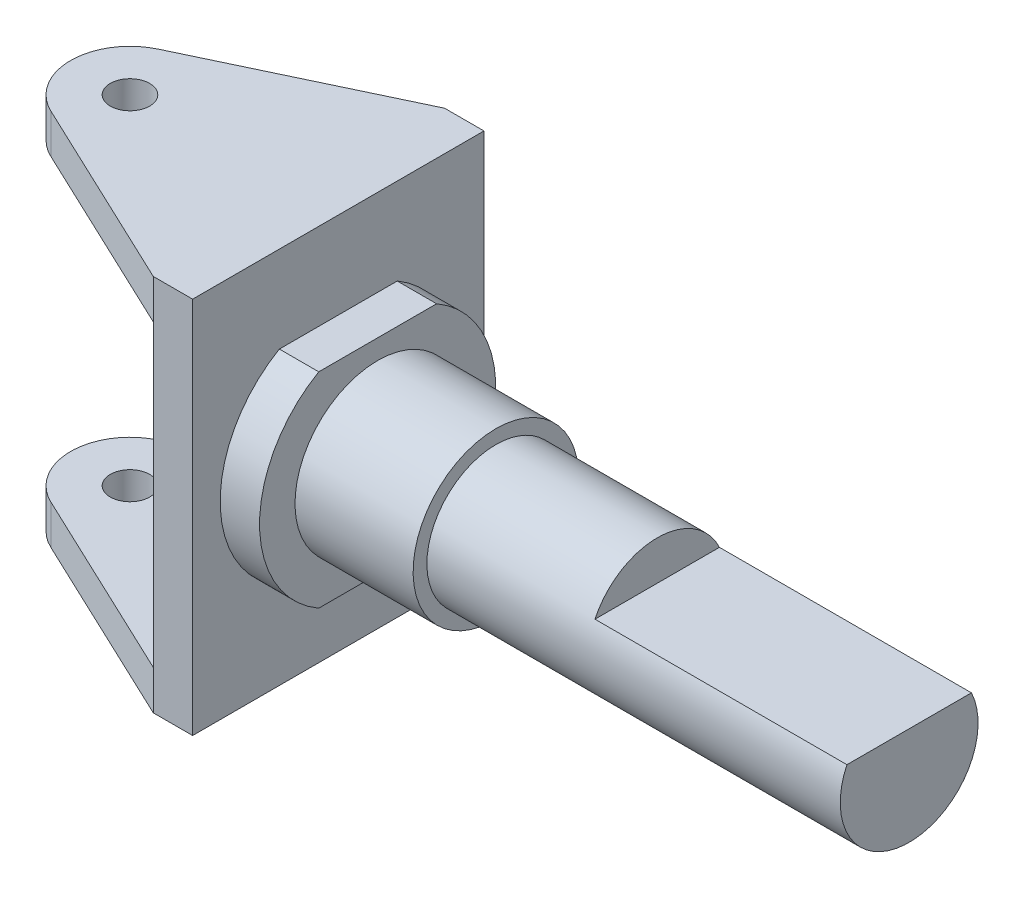
ISO-10303-21;
HEADER;
FILE_DESCRIPTION(('STEP AP214'),'2;1');
FILE_NAME('part.step','',(''),(''),'','','');
FILE_SCHEMA(('AUTOMOTIVE_DESIGN { 1 0 10303 214 1 1 1 1 }'));
ENDSEC;
DATA;
#1=APPLICATION_CONTEXT('core data for automotive mechanical design processes');
#2=APPLICATION_PROTOCOL_DEFINITION('international standard','automotive_design',2000,#1);
#3=PRODUCT_CONTEXT('',#1,'mechanical');
#4=PRODUCT('Part','Part','',(#3));
#5=PRODUCT_RELATED_PRODUCT_CATEGORY('part','',(#4));
#6=PRODUCT_DEFINITION_FORMATION('','',#4);
#7=PRODUCT_DEFINITION_CONTEXT('part definition',#1,'design');
#8=PRODUCT_DEFINITION('design','',#6,#7);
#9=PRODUCT_DEFINITION_SHAPE('','',#8);
#10=(LENGTH_UNIT() NAMED_UNIT(*) SI_UNIT(.MILLI.,.METRE.));
#11=(NAMED_UNIT(*) PLANE_ANGLE_UNIT() SI_UNIT($,.RADIAN.));
#12=(NAMED_UNIT(*) SI_UNIT($,.STERADIAN.) SOLID_ANGLE_UNIT());
#13=UNCERTAINTY_MEASURE_WITH_UNIT(LENGTH_MEASURE(1.E-05),#10,'distance_accuracy_value','');
#14=(GEOMETRIC_REPRESENTATION_CONTEXT(3) GLOBAL_UNCERTAINTY_ASSIGNED_CONTEXT((#13)) GLOBAL_UNIT_ASSIGNED_CONTEXT((#10,
#11,#12)) REPRESENTATION_CONTEXT('',''));
#15=CARTESIAN_POINT('',(0.,0.,0.));
#16=DIRECTION('',(0.,0.,1.));
#17=DIRECTION('',(1.,0.,0.));
#18=AXIS2_PLACEMENT_3D('',#15,#16,#17);
#19=CARTESIAN_POINT('',(10.,-38.,37.));
#20=DIRECTION('',(-1.,0.,0.));
#21=DIRECTION('',(0.,-1.,0.));
#22=AXIS2_PLACEMENT_3D('',#19,#20,#21);
#23=PLANE('',#22);
#24=DIRECTION('',(0.,1.,0.));
#25=VECTOR('',#24,1.);
#26=CARTESIAN_POINT('',(10.,-38.,-37.));
#27=LINE('',#26,#25);
#28=CARTESIAN_POINT('',(10.,-48.,-37.));
#29=VERTEX_POINT('',#28);
#30=CARTESIAN_POINT('',(10.,48.,-37.));
#31=VERTEX_POINT('',#30);
#32=EDGE_CURVE('E279',#29,#31,#27,.T.);
#33=ORIENTED_EDGE('',*,*,#32,.T.);
#34=DIRECTION('',(0.,0.,-1.));
#35=VECTOR('',#34,1.);
#36=CARTESIAN_POINT('',(10.,48.,37.));
#37=LINE('',#36,#35);
#38=CARTESIAN_POINT('',(10.,48.,37.));
#39=VERTEX_POINT('',#38);
#40=EDGE_CURVE('E301',#39,#31,#37,.T.);
#41=ORIENTED_EDGE('',*,*,#40,.F.);
#42=DIRECTION('',(0.,1.,0.));
#43=VECTOR('',#42,1.);
#44=CARTESIAN_POINT('',(10.,-38.,37.));
#45=LINE('',#44,#43);
#46=CARTESIAN_POINT('',(10.,-48.,37.));
#47=VERTEX_POINT('',#46);
#48=EDGE_CURVE('E297',#47,#39,#45,.T.);
#49=ORIENTED_EDGE('',*,*,#48,.F.);
#50=DIRECTION('',(0.,0.,-1.));
#51=VECTOR('',#50,1.);
#52=CARTESIAN_POINT('',(10.,-48.,37.));
#53=LINE('',#52,#51);
#54=EDGE_CURVE('E303',#47,#29,#53,.T.);
#55=ORIENTED_EDGE('',*,*,#54,.T.);
#56=EDGE_LOOP('',(#33,#41,#49,#55));
#57=FACE_BOUND('',#56,.T.);
#58=CARTESIAN_POINT('',(10.,0.,0.));
#59=DIRECTION('',(1.,0.,0.));
#60=DIRECTION('',(0.,1.,0.));
#61=AXIS2_PLACEMENT_3D('',#58,#59,#60);
#62=CIRCLE('',#61,30.);
#63=CARTESIAN_POINT('',(10.,26.,14.9666295470958));
#64=VERTEX_POINT('',#63);
#65=CARTESIAN_POINT('',(10.,-26.,14.9666295470958));
#66=VERTEX_POINT('',#65);
#67=EDGE_CURVE('E180',#64,#66,#62,.T.);
#68=ORIENTED_EDGE('',*,*,#67,.F.);
#69=DIRECTION('',(0.,0.,1.));
#70=VECTOR('',#69,1.);
#71=CARTESIAN_POINT('',(10.,26.,14.9666295470958));
#72=LINE('',#71,#70);
#73=CARTESIAN_POINT('',(10.,26.,-14.9666295470958));
#74=VERTEX_POINT('',#73);
#75=EDGE_CURVE('E187',#74,#64,#72,.T.);
#76=ORIENTED_EDGE('',*,*,#75,.F.);
#77=CARTESIAN_POINT('',(10.,0.,0.));
#78=DIRECTION('',(1.,0.,0.));
#79=DIRECTION('',(0.,1.,0.));
#80=AXIS2_PLACEMENT_3D('',#77,#78,#79);
#81=CIRCLE('',#80,30.);
#82=CARTESIAN_POINT('',(10.,-26.,-14.9666295470958));
#83=VERTEX_POINT('',#82);
#84=EDGE_CURVE('E197',#83,#74,#81,.T.);
#85=ORIENTED_EDGE('',*,*,#84,.F.);
#86=DIRECTION('',(0.,0.,-1.));
#87=VECTOR('',#86,1.);
#88=CARTESIAN_POINT('',(10.,-26.,14.9666295470958));
#89=LINE('',#88,#87);
#90=EDGE_CURVE('E62',#66,#83,#89,.T.);
#91=ORIENTED_EDGE('',*,*,#90,.F.);
#92=EDGE_LOOP('',(#68,#76,#85,#91));
#93=FACE_BOUND('',#92,.T.);
#94=ADVANCED_FACE('F37',(#57,#93),#23,.F.);
#95=CARTESIAN_POINT('',(0.,48.,37.));
#96=DIRECTION('',(0.,-1.,0.));
#97=DIRECTION('',(0.,0.,-1.));
#98=AXIS2_PLACEMENT_3D('',#95,#96,#97);
#99=PLANE('',#98);
#100=CARTESIAN_POINT('',(-42.9179291277196,48.,0.));
#101=DIRECTION('',(0.,1.,0.));
#102=DIRECTION('',(0.,0.,1.));
#103=AXIS2_PLACEMENT_3D('',#100,#101,#102);
#104=CIRCLE('',#103,5.);
#105=CARTESIAN_POINT('',(-42.9179291277196,48.,5.));
#106=VERTEX_POINT('',#105);
#107=EDGE_CURVE('E212',#106,#106,#104,.T.);
#108=ORIENTED_EDGE('',*,*,#107,.F.);
#109=EDGE_LOOP('',(#108));
#110=FACE_BOUND('',#109,.T.);
#111=CARTESIAN_POINT('',(-42.9179291277196,48.,0.));
#112=DIRECTION('',(0.,1.,0.));
#113=DIRECTION('',(0.,0.,1.));
#114=AXIS2_PLACEMENT_3D('',#111,#112,#113);
#115=CIRCLE('',#114,15.0820708722803);
#116=CARTESIAN_POINT('',(-49.370277543495,48.,-13.6321701030294));
#117=VERTEX_POINT('',#116);
#118=CARTESIAN_POINT('',(-49.370277543495,48.000006,13.6321701030294));
#119=VERTEX_POINT('',#118);
#120=EDGE_CURVE('E269',#117,#119,#115,.T.);
#121=ORIENTED_EDGE('',*,*,#120,.T.);
#122=DIRECTION('',(-0.903865935816828,0.,-0.427815813253753));
#123=VECTOR('',#122,1.);
#124=CARTESIAN_POINT('',(0.,48.,37.));
#125=LINE('',#124,#123);
#126=CARTESIAN_POINT('',(0.,48.,37.));
#127=VERTEX_POINT('',#126);
#128=EDGE_CURVE('E244',#127,#119,#125,.T.);
#129=ORIENTED_EDGE('',*,*,#128,.F.);
#130=DIRECTION('',(1.,0.,0.));
#131=VECTOR('',#130,1.);
#132=CARTESIAN_POINT('',(0.,48.,37.));
#133=LINE('',#132,#131);
#134=EDGE_CURVE('E275',#39,#127,#133,.F.);
#135=ORIENTED_EDGE('',*,*,#134,.F.);
#136=ORIENTED_EDGE('',*,*,#40,.T.);
#137=DIRECTION('',(1.,0.,0.));
#138=VECTOR('',#137,1.);
#139=CARTESIAN_POINT('',(0.,48.,-37.));
#140=LINE('',#139,#138);
#141=CARTESIAN_POINT('',(0.,48.,-37.));
#142=VERTEX_POINT('',#141);
#143=EDGE_CURVE('E282',#31,#142,#140,.F.);
#144=ORIENTED_EDGE('',*,*,#143,.T.);
#145=DIRECTION('',(0.903865935816828,0.,-0.427815813253753));
#146=VECTOR('',#145,1.);
#147=CARTESIAN_POINT('',(-49.370277543495,48.,-13.6321701030294));
#148=LINE('',#147,#146);
#149=EDGE_CURVE('E263',#142,#117,#148,.F.);
#150=ORIENTED_EDGE('',*,*,#149,.T.);
#151=EDGE_LOOP('',(#121,#129,#135,#136,#144,#150));
#152=FACE_BOUND('',#151,.T.);
#153=ADVANCED_FACE('F39',(#110,#152),#99,.F.);
#154=CARTESIAN_POINT('',(0.,38.,37.));
#155=DIRECTION('',(0.,-1.,0.));
#156=DIRECTION('',(0.,0.,-1.));
#157=AXIS2_PLACEMENT_3D('',#154,#155,#156);
#158=PLANE('',#157);
#159=CARTESIAN_POINT('',(-42.9179291277196,38.,0.));
#160=DIRECTION('',(0.,-1.,0.));
#161=DIRECTION('',(0.,0.,-1.));
#162=AXIS2_PLACEMENT_3D('',#159,#160,#161);
#163=CIRCLE('',#162,5.);
#164=CARTESIAN_POINT('',(-42.9179291277196,38.,-4.99999999999999));
#165=VERTEX_POINT('',#164);
#166=EDGE_CURVE('E221',#165,#165,#163,.T.);
#167=ORIENTED_EDGE('',*,*,#166,.F.);
#168=EDGE_LOOP('',(#167));
#169=FACE_BOUND('',#168,.T.);
#170=DIRECTION('',(-0.903865935816828,0.,-0.427815813253753));
#171=VECTOR('',#170,1.);
#172=CARTESIAN_POINT('',(0.,38.,37.));
#173=LINE('',#172,#171);
#174=CARTESIAN_POINT('',(0.,38.,37.));
#175=VERTEX_POINT('',#174);
#176=CARTESIAN_POINT('',(-49.370277543495,38.,13.6321701030294));
#177=VERTEX_POINT('',#176);
#178=EDGE_CURVE('E348',#175,#177,#173,.T.);
#179=ORIENTED_EDGE('',*,*,#178,.T.);
#180=CARTESIAN_POINT('',(-42.9179291277196,38.,0.));
#181=DIRECTION('',(0.,-1.,0.));
#182=DIRECTION('',(0.,0.,-1.));
#183=AXIS2_PLACEMENT_3D('',#180,#181,#182);
#184=CIRCLE('',#183,15.0820708722803);
#185=CARTESIAN_POINT('',(-49.370277543495,38.,-13.6321701030294));
#186=VERTEX_POINT('',#185);
#187=EDGE_CURVE('E266',#177,#186,#184,.T.);
#188=ORIENTED_EDGE('',*,*,#187,.T.);
#189=DIRECTION('',(0.903865935816828,0.,-0.427815813253753));
#190=VECTOR('',#189,1.);
#191=CARTESIAN_POINT('',(-28.6149223898842,38.,-23.4560486148222));
#192=LINE('',#191,#190);
#193=CARTESIAN_POINT('',(0.,38.,-37.));
#194=VERTEX_POINT('',#193);
#195=EDGE_CURVE('E260',#186,#194,#192,.T.);
#196=ORIENTED_EDGE('',*,*,#195,.T.);
#197=DIRECTION('',(0.,0.,-1.));
#198=VECTOR('',#197,1.);
#199=CARTESIAN_POINT('',(0.,38.,37.));
#200=LINE('',#199,#198);
#201=EDGE_CURVE('E309',#175,#194,#200,.T.);
#202=ORIENTED_EDGE('',*,*,#201,.F.);
#203=EDGE_LOOP('',(#179,#188,#196,#202));
#204=FACE_BOUND('',#203,.T.);
#205=ADVANCED_FACE('F319',(#169,#204),#158,.T.);
#206=CARTESIAN_POINT('',(-58.,-38.,37.));
#207=DIRECTION('',(0.,1.,0.));
#208=DIRECTION('',(0.,0.,1.));
#209=AXIS2_PLACEMENT_3D('',#206,#207,#208);
#210=PLANE('',#209);
#211=CARTESIAN_POINT('',(-42.9179291277196,-38.,0.));
#212=DIRECTION('',(0.,1.,0.));
#213=DIRECTION('',(0.,0.,1.));
#214=AXIS2_PLACEMENT_3D('',#211,#212,#213);
#215=CIRCLE('',#214,5.);
#216=CARTESIAN_POINT('',(-42.9179291277196,-38.,5.));
#217=VERTEX_POINT('',#216);
#218=EDGE_CURVE('E216',#217,#217,#215,.T.);
#219=ORIENTED_EDGE('',*,*,#218,.F.);
#220=EDGE_LOOP('',(#219));
#221=FACE_BOUND('',#220,.T.);
#222=CARTESIAN_POINT('',(-42.9179291277196,-38.,0.));
#223=DIRECTION('',(0.,1.,0.));
#224=DIRECTION('',(0.,0.,1.));
#225=AXIS2_PLACEMENT_3D('',#222,#223,#224);
#226=CIRCLE('',#225,15.0820708722803);
#227=CARTESIAN_POINT('',(-49.370277543495,-38.,-13.6321701030294));
#228=VERTEX_POINT('',#227);
#229=CARTESIAN_POINT('',(-49.370277543495,-38.,13.6321701030294));
#230=VERTEX_POINT('',#229);
#231=EDGE_CURVE('E264',#228,#230,#226,.T.);
#232=ORIENTED_EDGE('',*,*,#231,.T.);
#233=DIRECTION('',(0.903865935816828,0.,0.427815813253753));
#234=VECTOR('',#233,1.);
#235=CARTESIAN_POINT('',(-47.3844705359418,-38.,14.5720878565773));
#236=LINE('',#235,#234);
#237=CARTESIAN_POINT('',(0.,-38.,37.));
#238=VERTEX_POINT('',#237);
#239=EDGE_CURVE('E335',#230,#238,#236,.T.);
#240=ORIENTED_EDGE('',*,*,#239,.T.);
#241=DIRECTION('',(0.,0.,-1.));
#242=VECTOR('',#241,1.);
#243=CARTESIAN_POINT('',(0.,-38.,37.));
#244=LINE('',#243,#242);
#245=CARTESIAN_POINT('',(0.,-38.,-37.));
#246=VERTEX_POINT('',#245);
#247=EDGE_CURVE('E306',#238,#246,#244,.T.);
#248=ORIENTED_EDGE('',*,*,#247,.T.);
#249=DIRECTION('',(-0.903865935816828,0.,0.427815813253753));
#250=VECTOR('',#249,1.);
#251=CARTESIAN_POINT('',(-75.9993929258259,-38.,-1.02813647139947));
#252=LINE('',#251,#250);
#253=EDGE_CURVE('E250',#246,#228,#252,.T.);
#254=ORIENTED_EDGE('',*,*,#253,.T.);
#255=EDGE_LOOP('',(#232,#240,#248,#254));
#256=FACE_BOUND('',#255,.T.);
#257=ADVANCED_FACE('F333',(#221,#256),#210,.T.);
#258=CARTESIAN_POINT('',(-58.,-48.,37.));
#259=DIRECTION('',(0.,1.,0.));
#260=DIRECTION('',(0.,0.,1.));
#261=AXIS2_PLACEMENT_3D('',#258,#259,#260);
#262=PLANE('',#261);
#263=CARTESIAN_POINT('',(-42.9179291277196,-48.,0.));
#264=DIRECTION('',(0.,1.,0.));
#265=DIRECTION('',(0.,0.,1.));
#266=AXIS2_PLACEMENT_3D('',#263,#264,#265);
#267=CIRCLE('',#266,5.);
#268=CARTESIAN_POINT('',(-42.9179291277196,-48.,5.));
#269=VERTEX_POINT('',#268);
#270=EDGE_CURVE('E213',#269,#269,#267,.T.);
#271=ORIENTED_EDGE('',*,*,#270,.T.);
#272=EDGE_LOOP('',(#271));
#273=FACE_BOUND('',#272,.T.);
#274=DIRECTION('',(0.903865935816828,0.,0.427815813253753));
#275=VECTOR('',#274,1.);
#276=CARTESIAN_POINT('',(-14.3074611949421,-48.,30.2280243074111));
#277=LINE('',#276,#275);
#278=CARTESIAN_POINT('',(-49.370277543495,-48.,13.6321701030294));
#279=VERTEX_POINT('',#278);
#280=CARTESIAN_POINT('',(0.,-48.,37.));
#281=VERTEX_POINT('',#280);
#282=EDGE_CURVE('E229',#279,#281,#277,.T.);
#283=ORIENTED_EDGE('',*,*,#282,.F.);
#284=CARTESIAN_POINT('',(-42.9179291277196,-48.,0.));
#285=DIRECTION('',(0.,1.,0.));
#286=DIRECTION('',(0.,0.,1.));
#287=AXIS2_PLACEMENT_3D('',#284,#285,#286);
#288=CIRCLE('',#287,15.0820708722803);
#289=CARTESIAN_POINT('',(-49.370277543495,-48.,-13.6321701030294));
#290=VERTEX_POINT('',#289);
#291=EDGE_CURVE('E241',#290,#279,#288,.T.);
#292=ORIENTED_EDGE('',*,*,#291,.F.);
#293=DIRECTION('',(-0.903865935816828,0.,0.427815813253753));
#294=VECTOR('',#293,1.);
#295=CARTESIAN_POINT('',(-14.3074611949421,-48.,-30.2280243074111));
#296=LINE('',#295,#294);
#297=CARTESIAN_POINT('',(0.,-48.,-37.));
#298=VERTEX_POINT('',#297);
#299=EDGE_CURVE('E243',#298,#290,#296,.T.);
#300=ORIENTED_EDGE('',*,*,#299,.F.);
#301=DIRECTION('',(1.,0.,0.));
#302=VECTOR('',#301,1.);
#303=CARTESIAN_POINT('',(-58.,-48.,-37.));
#304=LINE('',#303,#302);
#305=EDGE_CURVE('E294',#298,#29,#304,.T.);
#306=ORIENTED_EDGE('',*,*,#305,.T.);
#307=ORIENTED_EDGE('',*,*,#54,.F.);
#308=DIRECTION('',(1.,0.,0.));
#309=VECTOR('',#308,1.);
#310=CARTESIAN_POINT('',(-58.,-48.,37.));
#311=LINE('',#310,#309);
#312=EDGE_CURVE('E340',#281,#47,#311,.T.);
#313=ORIENTED_EDGE('',*,*,#312,.F.);
#314=EDGE_LOOP('',(#283,#292,#300,#306,#307,#313));
#315=FACE_BOUND('',#314,.T.);
#316=ADVANCED_FACE('F356',(#273,#315),#262,.F.);
#317=CARTESIAN_POINT('',(0.,0.,37.));
#318=DIRECTION('',(0.,0.,1.));
#319=DIRECTION('',(1.,0.,0.));
#320=AXIS2_PLACEMENT_3D('',#317,#318,#319);
#321=PLANE('',#320);
#322=ORIENTED_EDGE('',*,*,#134,.T.);
#323=DIRECTION('',(0.,-1.,0.));
#324=VECTOR('',#323,1.);
#325=CARTESIAN_POINT('',(0.,0.,37.));
#326=LINE('',#325,#324);
#327=EDGE_CURVE('E11',#127,#175,#326,.T.);
#328=ORIENTED_EDGE('',*,*,#327,.T.);
#329=DIRECTION('',(0.,1.,0.));
#330=VECTOR('',#329,1.);
#331=CARTESIAN_POINT('',(0.,-38.,37.));
#332=LINE('',#331,#330);
#333=EDGE_CURVE('E272',#238,#175,#332,.T.);
#334=ORIENTED_EDGE('',*,*,#333,.F.);
#335=DIRECTION('',(0.,1.,0.));
#336=VECTOR('',#335,1.);
#337=CARTESIAN_POINT('',(0.,-48.,37.));
#338=LINE('',#337,#336);
#339=EDGE_CURVE('E227',#281,#238,#338,.T.);
#340=ORIENTED_EDGE('',*,*,#339,.F.);
#341=ORIENTED_EDGE('',*,*,#312,.T.);
#342=ORIENTED_EDGE('',*,*,#48,.T.);
#343=EDGE_LOOP('',(#322,#328,#334,#340,#341,#342));
#344=FACE_BOUND('',#343,.T.);
#345=ADVANCED_FACE('F338',(#344),#321,.T.);
#346=CARTESIAN_POINT('',(0.,0.,-37.));
#347=DIRECTION('',(0.,0.,1.));
#348=DIRECTION('',(1.,0.,0.));
#349=AXIS2_PLACEMENT_3D('',#346,#347,#348);
#350=PLANE('',#349);
#351=DIRECTION('',(0.,-1.,0.));
#352=VECTOR('',#351,1.);
#353=CARTESIAN_POINT('',(0.,0.,-37.));
#354=LINE('',#353,#352);
#355=EDGE_CURVE('E46',#142,#194,#354,.T.);
#356=ORIENTED_EDGE('',*,*,#355,.F.);
#357=ORIENTED_EDGE('',*,*,#143,.F.);
#358=ORIENTED_EDGE('',*,*,#32,.F.);
#359=ORIENTED_EDGE('',*,*,#305,.F.);
#360=DIRECTION('',(0.,1.,0.));
#361=VECTOR('',#360,1.);
#362=CARTESIAN_POINT('',(0.,-48.,-37.));
#363=LINE('',#362,#361);
#364=EDGE_CURVE('E247',#298,#246,#363,.T.);
#365=ORIENTED_EDGE('',*,*,#364,.T.);
#366=DIRECTION('',(0.,1.,0.));
#367=VECTOR('',#366,1.);
#368=CARTESIAN_POINT('',(0.,-38.,-37.));
#369=LINE('',#368,#367);
#370=EDGE_CURVE('E289',#246,#194,#369,.T.);
#371=ORIENTED_EDGE('',*,*,#370,.T.);
#372=EDGE_LOOP('',(#356,#357,#358,#359,#365,#371));
#373=FACE_BOUND('',#372,.T.);
#374=ADVANCED_FACE('F326',(#373),#350,.F.);
#375=CARTESIAN_POINT('',(0.,-38.,37.));
#376=DIRECTION('',(-1.,0.,0.));
#377=DIRECTION('',(0.,-1.,0.));
#378=AXIS2_PLACEMENT_3D('',#375,#376,#377);
#379=PLANE('',#378);
#380=ORIENTED_EDGE('',*,*,#370,.F.);
#381=ORIENTED_EDGE('',*,*,#247,.F.);
#382=ORIENTED_EDGE('',*,*,#333,.T.);
#383=ORIENTED_EDGE('',*,*,#201,.T.);
#384=EDGE_LOOP('',(#380,#381,#382,#383));
#385=FACE_BOUND('',#384,.T.);
#386=ADVANCED_FACE('F323',(#385),#379,.T.);
#387=CARTESIAN_POINT('',(-14.3074611949421,-48.,-30.2280243074111));
#388=DIRECTION('',(-0.427815813253753,0.,-0.903865935816828));
#389=DIRECTION('',(-0.903865935816828,0.,0.427815813253753));
#390=AXIS2_PLACEMENT_3D('',#387,#388,#389);
#391=PLANE('',#390);
#392=ORIENTED_EDGE('',*,*,#364,.F.);
#393=ORIENTED_EDGE('',*,*,#299,.T.);
#394=DIRECTION('',(0.,1.,0.));
#395=VECTOR('',#394,1.);
#396=CARTESIAN_POINT('',(-49.370277543495,-48.,-13.6321701030294));
#397=LINE('',#396,#395);
#398=EDGE_CURVE('E251',#290,#228,#397,.T.);
#399=ORIENTED_EDGE('',*,*,#398,.T.);
#400=ORIENTED_EDGE('',*,*,#253,.F.);
#401=EDGE_LOOP('',(#392,#393,#399,#400));
#402=FACE_BOUND('',#401,.T.);
#403=ADVANCED_FACE('F358',(#402),#391,.T.);
#404=CARTESIAN_POINT('',(-42.9179291277196,-48.,0.));
#405=DIRECTION('',(0.,1.,0.));
#406=DIRECTION('',(0.,0.,1.));
#407=AXIS2_PLACEMENT_3D('',#404,#405,#406);
#408=CYLINDRICAL_SURFACE('',#407,15.0820708722803);
#409=ORIENTED_EDGE('',*,*,#398,.F.);
#410=ORIENTED_EDGE('',*,*,#291,.T.);
#411=DIRECTION('',(0.,1.,0.));
#412=VECTOR('',#411,1.);
#413=CARTESIAN_POINT('',(-49.370277543495,-48.,13.6321701030294));
#414=LINE('',#413,#412);
#415=EDGE_CURVE('E230',#279,#230,#414,.T.);
#416=ORIENTED_EDGE('',*,*,#415,.T.);
#417=ORIENTED_EDGE('',*,*,#231,.F.);
#418=EDGE_LOOP('',(#409,#410,#416,#417));
#419=FACE_BOUND('',#418,.T.);
#420=ADVANCED_FACE('F360',(#419),#408,.T.);
#421=ORIENTED_EDGE('',*,*,#120,.F.);
#422=EDGE_CURVE('E246',#186,#117,#397,.T.);
#423=ORIENTED_EDGE('',*,*,#422,.F.);
#424=ORIENTED_EDGE('',*,*,#187,.F.);
#425=EDGE_CURVE('E224',#177,#119,#414,.T.);
#426=ORIENTED_EDGE('',*,*,#425,.T.);
#427=EDGE_LOOP('',(#421,#423,#424,#426));
#428=FACE_BOUND('',#427,.T.);
#429=ADVANCED_FACE('F362',(#428),#408,.T.);
#430=ORIENTED_EDGE('',*,*,#149,.F.);
#431=ORIENTED_EDGE('',*,*,#355,.T.);
#432=ORIENTED_EDGE('',*,*,#195,.F.);
#433=ORIENTED_EDGE('',*,*,#422,.T.);
#434=EDGE_LOOP('',(#430,#431,#432,#433));
#435=FACE_BOUND('',#434,.T.);
#436=ADVANCED_FACE('F313',(#435),#391,.T.);
#437=CARTESIAN_POINT('',(-14.3074611949421,-48.,30.2280243074111));
#438=DIRECTION('',(-0.427815813253753,0.,0.903865935816828));
#439=DIRECTION('',(0.903865935816828,0.,0.427815813253753));
#440=AXIS2_PLACEMENT_3D('',#437,#438,#439);
#441=PLANE('',#440);
#442=ORIENTED_EDGE('',*,*,#128,.T.);
#443=ORIENTED_EDGE('',*,*,#425,.F.);
#444=ORIENTED_EDGE('',*,*,#178,.F.);
#445=ORIENTED_EDGE('',*,*,#327,.F.);
#446=EDGE_LOOP('',(#442,#443,#444,#445));
#447=FACE_BOUND('',#446,.T.);
#448=ADVANCED_FACE('F410',(#447),#441,.T.);
#449=ORIENTED_EDGE('',*,*,#415,.F.);
#450=ORIENTED_EDGE('',*,*,#282,.T.);
#451=ORIENTED_EDGE('',*,*,#339,.T.);
#452=ORIENTED_EDGE('',*,*,#239,.F.);
#453=EDGE_LOOP('',(#449,#450,#451,#452));
#454=FACE_BOUND('',#453,.T.);
#455=ADVANCED_FACE('F353',(#454),#441,.T.);
#456=CARTESIAN_POINT('',(-42.9179291277196,-48.,0.));
#457=DIRECTION('',(0.,1.,0.));
#458=DIRECTION('',(0.,0.,1.));
#459=AXIS2_PLACEMENT_3D('',#456,#457,#458);
#460=CYLINDRICAL_SURFACE('',#459,5.);
#461=ORIENTED_EDGE('',*,*,#218,.T.);
#462=EDGE_LOOP('',(#461));
#463=FACE_BOUND('',#462,.T.);
#464=ORIENTED_EDGE('',*,*,#270,.F.);
#465=EDGE_LOOP('',(#464));
#466=FACE_BOUND('',#465,.T.);
#467=ADVANCED_FACE('F396',(#463,#466),#460,.F.);
#468=ORIENTED_EDGE('',*,*,#166,.T.);
#469=EDGE_LOOP('',(#468));
#470=FACE_BOUND('',#469,.T.);
#471=ORIENTED_EDGE('',*,*,#107,.T.);
#472=EDGE_LOOP('',(#471));
#473=FACE_BOUND('',#472,.T.);
#474=ADVANCED_FACE('F392',(#470,#473),#460,.F.);
#475=CARTESIAN_POINT('',(20.,0.,0.));
#476=DIRECTION('',(-1.,0.,0.));
#477=DIRECTION('',(0.,-1.,0.));
#478=AXIS2_PLACEMENT_3D('',#475,#476,#477);
#479=CYLINDRICAL_SURFACE('',#478,30.);
#480=ORIENTED_EDGE('',*,*,#67,.T.);
#481=DIRECTION('',(-1.,0.,0.));
#482=VECTOR('',#481,1.);
#483=CARTESIAN_POINT('',(20.,-26.,14.9666295470958));
#484=LINE('',#483,#482);
#485=CARTESIAN_POINT('',(20.,-26.,14.9666295470958));
#486=VERTEX_POINT('',#485);
#487=EDGE_CURVE('E210',#486,#66,#484,.T.);
#488=ORIENTED_EDGE('',*,*,#487,.F.);
#489=CARTESIAN_POINT('',(20.,0.,0.));
#490=DIRECTION('',(1.,0.,0.));
#491=DIRECTION('',(0.,1.,0.));
#492=AXIS2_PLACEMENT_3D('',#489,#490,#491);
#493=CIRCLE('',#492,30.);
#494=CARTESIAN_POINT('',(20.,26.,14.9666295470958));
#495=VERTEX_POINT('',#494);
#496=EDGE_CURVE('E183',#495,#486,#493,.T.);
#497=ORIENTED_EDGE('',*,*,#496,.F.);
#498=DIRECTION('',(-1.,0.,0.));
#499=VECTOR('',#498,1.);
#500=CARTESIAN_POINT('',(20.,26.,14.9666295470958));
#501=LINE('',#500,#499);
#502=EDGE_CURVE('E193',#495,#64,#501,.T.);
#503=ORIENTED_EDGE('',*,*,#502,.T.);
#504=EDGE_LOOP('',(#480,#488,#497,#503));
#505=FACE_BOUND('',#504,.T.);
#506=ADVANCED_FACE('F395',(#505),#479,.T.);
#507=CARTESIAN_POINT('',(20.,-26.,14.9666295470958));
#508=DIRECTION('',(0.,1.,0.));
#509=DIRECTION('',(-1.,0.,0.));
#510=AXIS2_PLACEMENT_3D('',#507,#508,#509);
#511=PLANE('',#510);
#512=ORIENTED_EDGE('',*,*,#90,.T.);
#513=DIRECTION('',(-1.,0.,0.));
#514=VECTOR('',#513,1.);
#515=CARTESIAN_POINT('',(20.,-26.,-14.9666295470958));
#516=LINE('',#515,#514);
#517=CARTESIAN_POINT('',(20.,-26.,-14.9666295470958));
#518=VERTEX_POINT('',#517);
#519=EDGE_CURVE('E207',#518,#83,#516,.T.);
#520=ORIENTED_EDGE('',*,*,#519,.F.);
#521=DIRECTION('',(0.,0.,-1.));
#522=VECTOR('',#521,1.);
#523=CARTESIAN_POINT('',(20.,-26.,14.9666295470958));
#524=LINE('',#523,#522);
#525=EDGE_CURVE('E186',#486,#518,#524,.T.);
#526=ORIENTED_EDGE('',*,*,#525,.F.);
#527=ORIENTED_EDGE('',*,*,#487,.T.);
#528=EDGE_LOOP('',(#512,#520,#526,#527));
#529=FACE_BOUND('',#528,.T.);
#530=ADVANCED_FACE('F403',(#529),#511,.F.);
#531=CARTESIAN_POINT('',(20.,0.,0.));
#532=DIRECTION('',(-1.,0.,0.));
#533=DIRECTION('',(0.,-1.,0.));
#534=AXIS2_PLACEMENT_3D('',#531,#532,#533);
#535=CYLINDRICAL_SURFACE('',#534,30.);
#536=ORIENTED_EDGE('',*,*,#84,.T.);
#537=DIRECTION('',(-1.,0.,0.));
#538=VECTOR('',#537,1.);
#539=CARTESIAN_POINT('',(20.,26.,-14.9666295470958));
#540=LINE('',#539,#538);
#541=CARTESIAN_POINT('',(20.,26.,-14.9666295470958));
#542=VERTEX_POINT('',#541);
#543=EDGE_CURVE('E204',#542,#74,#540,.T.);
#544=ORIENTED_EDGE('',*,*,#543,.F.);
#545=CARTESIAN_POINT('',(20.,0.,0.));
#546=DIRECTION('',(1.,0.,0.));
#547=DIRECTION('',(0.,1.,0.));
#548=AXIS2_PLACEMENT_3D('',#545,#546,#547);
#549=CIRCLE('',#548,30.);
#550=EDGE_CURVE('E189',#518,#542,#549,.T.);
#551=ORIENTED_EDGE('',*,*,#550,.F.);
#552=ORIENTED_EDGE('',*,*,#519,.T.);
#553=EDGE_LOOP('',(#536,#544,#551,#552));
#554=FACE_BOUND('',#553,.T.);
#555=ADVANCED_FACE('F514',(#554),#535,.T.);
#556=CARTESIAN_POINT('',(20.,26.,14.9666295470958));
#557=DIRECTION('',(0.,-1.,0.));
#558=DIRECTION('',(1.,0.,0.));
#559=AXIS2_PLACEMENT_3D('',#556,#557,#558);
#560=PLANE('',#559);
#561=ORIENTED_EDGE('',*,*,#75,.T.);
#562=ORIENTED_EDGE('',*,*,#502,.F.);
#563=DIRECTION('',(0.,0.,1.));
#564=VECTOR('',#563,1.);
#565=CARTESIAN_POINT('',(20.,26.,14.9666295470958));
#566=LINE('',#565,#564);
#567=EDGE_CURVE('E191',#542,#495,#566,.T.);
#568=ORIENTED_EDGE('',*,*,#567,.F.);
#569=ORIENTED_EDGE('',*,*,#543,.T.);
#570=EDGE_LOOP('',(#561,#562,#568,#569));
#571=FACE_BOUND('',#570,.T.);
#572=ADVANCED_FACE('F523',(#571),#560,.F.);
#573=CARTESIAN_POINT('',(20.,0.,0.));
#574=DIRECTION('',(1.,0.,0.));
#575=DIRECTION('',(0.,1.,0.));
#576=AXIS2_PLACEMENT_3D('',#573,#574,#575);
#577=PLANE('',#576);
#578=CARTESIAN_POINT('',(20.,0.,0.));
#579=DIRECTION('',(1.,0.,0.));
#580=DIRECTION('',(0.,1.,0.));
#581=AXIS2_PLACEMENT_3D('',#578,#579,#580);
#582=CIRCLE('',#581,21.);
#583=CARTESIAN_POINT('',(20.,21.,0.));
#584=VERTEX_POINT('',#583);
#585=EDGE_CURVE('E174',#584,#584,#582,.T.);
#586=ORIENTED_EDGE('',*,*,#585,.F.);
#587=EDGE_LOOP('',(#586));
#588=FACE_BOUND('',#587,.T.);
#589=ORIENTED_EDGE('',*,*,#496,.T.);
#590=ORIENTED_EDGE('',*,*,#525,.T.);
#591=ORIENTED_EDGE('',*,*,#550,.T.);
#592=ORIENTED_EDGE('',*,*,#567,.T.);
#593=EDGE_LOOP('',(#589,#590,#591,#592));
#594=FACE_BOUND('',#593,.T.);
#595=ADVANCED_FACE('F533',(#588,#594),#577,.T.);
#596=CARTESIAN_POINT('',(50.,0.,0.));
#597=DIRECTION('',(-1.,0.,0.));
#598=DIRECTION('',(0.,-1.,0.));
#599=AXIS2_PLACEMENT_3D('',#596,#597,#598);
#600=CYLINDRICAL_SURFACE('',#599,21.);
#601=CARTESIAN_POINT('',(50.,0.,0.));
#602=DIRECTION('',(1.,0.,0.));
#603=DIRECTION('',(0.,1.,0.));
#604=AXIS2_PLACEMENT_3D('',#601,#602,#603);
#605=CIRCLE('',#604,21.);
#606=CARTESIAN_POINT('',(50.,21.,0.));
#607=VERTEX_POINT('',#606);
#608=EDGE_CURVE('E177',#607,#607,#605,.T.);
#609=ORIENTED_EDGE('',*,*,#608,.F.);
#610=EDGE_LOOP('',(#609));
#611=FACE_BOUND('',#610,.T.);
#612=ORIENTED_EDGE('',*,*,#585,.T.);
#613=EDGE_LOOP('',(#612));
#614=FACE_BOUND('',#613,.T.);
#615=ADVANCED_FACE('F543',(#611,#614),#600,.T.);
#616=CARTESIAN_POINT('',(50.,0.,0.));
#617=DIRECTION('',(1.,0.,0.));
#618=DIRECTION('',(0.,1.,0.));
#619=AXIS2_PLACEMENT_3D('',#616,#617,#618);
#620=PLANE('',#619);
#621=CARTESIAN_POINT('',(50.,0.,0.));
#622=DIRECTION('',(1.,0.,0.));
#623=DIRECTION('',(0.,1.,0.));
#624=AXIS2_PLACEMENT_3D('',#621,#622,#623);
#625=CIRCLE('',#624,17.5);
#626=CARTESIAN_POINT('',(50.,17.5,0.));
#627=VERTEX_POINT('',#626);
#628=EDGE_CURVE('E169',#627,#627,#625,.T.);
#629=ORIENTED_EDGE('',*,*,#628,.F.);
#630=EDGE_LOOP('',(#629));
#631=FACE_BOUND('',#630,.T.);
#632=ORIENTED_EDGE('',*,*,#608,.T.);
#633=EDGE_LOOP('',(#632));
#634=FACE_BOUND('',#633,.T.);
#635=ADVANCED_FACE('F553',(#631,#634),#620,.T.);
#636=CARTESIAN_POINT('',(155.,0.,0.));
#637=DIRECTION('',(-1.,0.,0.));
#638=DIRECTION('',(0.,-1.,0.));
#639=AXIS2_PLACEMENT_3D('',#636,#637,#638);
#640=CYLINDRICAL_SURFACE('',#639,17.5);
#641=CARTESIAN_POINT('',(155.,0.,0.));
#642=DIRECTION('',(1.,0.,0.));
#643=DIRECTION('',(0.,1.,0.));
#644=AXIS2_PLACEMENT_3D('',#641,#642,#643);
#645=CIRCLE('',#644,17.5);
#646=CARTESIAN_POINT('',(155.,7.50000000000005,15.8113883008419));
#647=VERTEX_POINT('',#646);
#648=CARTESIAN_POINT('',(155.,7.50000000000005,-15.8113883008419));
#649=VERTEX_POINT('',#648);
#650=EDGE_CURVE('E167',#647,#649,#645,.T.);
#651=ORIENTED_EDGE('',*,*,#650,.F.);
#652=DIRECTION('',(1.,0.,0.));
#653=VECTOR('',#652,1.);
#654=CARTESIAN_POINT('',(91.,7.50000000000003,15.8113883008419));
#655=LINE('',#654,#653);
#656=CARTESIAN_POINT('',(91.,7.50000000000003,15.8113883008419));
#657=VERTEX_POINT('',#656);
#658=EDGE_CURVE('E54',#657,#647,#655,.T.);
#659=ORIENTED_EDGE('',*,*,#658,.F.);
#660=CARTESIAN_POINT('',(91.,0.,0.));
#661=DIRECTION('',(1.,0.,0.));
#662=DIRECTION('',(0.,1.,0.));
#663=AXIS2_PLACEMENT_3D('',#660,#661,#662);
#664=CIRCLE('',#663,17.5);
#665=CARTESIAN_POINT('',(91.,7.50000000000003,-15.8113883008419));
#666=VERTEX_POINT('',#665);
#667=EDGE_CURVE('E153',#666,#657,#664,.T.);
#668=ORIENTED_EDGE('',*,*,#667,.F.);
#669=DIRECTION('',(1.,0.,0.));
#670=VECTOR('',#669,1.);
#671=CARTESIAN_POINT('',(91.,7.50000000000003,-15.8113883008419));
#672=LINE('',#671,#670);
#673=EDGE_CURVE('E161',#666,#649,#672,.T.);
#674=ORIENTED_EDGE('',*,*,#673,.T.);
#675=EDGE_LOOP('',(#651,#659,#668,#674));
#676=FACE_BOUND('',#675,.T.);
#677=ORIENTED_EDGE('',*,*,#628,.T.);
#678=EDGE_LOOP('',(#677));
#679=FACE_BOUND('',#678,.T.);
#680=ADVANCED_FACE('F164',(#676,#679),#640,.T.);
#681=CARTESIAN_POINT('',(155.,0.,0.));
#682=DIRECTION('',(1.,0.,0.));
#683=DIRECTION('',(0.,1.,0.));
#684=AXIS2_PLACEMENT_3D('',#681,#682,#683);
#685=PLANE('',#684);
#686=DIRECTION('',(0.,0.,-1.));
#687=VECTOR('',#686,1.);
#688=CARTESIAN_POINT('',(155.,7.50000000000005,15.8113883008419));
#689=LINE('',#688,#687);
#690=EDGE_CURVE('E158',#647,#649,#689,.T.);
#691=ORIENTED_EDGE('',*,*,#690,.F.);
#692=ORIENTED_EDGE('',*,*,#650,.T.);
#693=EDGE_LOOP('',(#691,#692));
#694=FACE_BOUND('',#693,.T.);
#695=ADVANCED_FACE('F572',(#694),#685,.T.);
#696=CARTESIAN_POINT('',(91.,7.50000000000003,15.8113883008419));
#697=DIRECTION('',(0.,-1.,0.));
#698=DIRECTION('',(1.,0.,0.));
#699=AXIS2_PLACEMENT_3D('',#696,#697,#698);
#700=PLANE('',#699);
#701=ORIENTED_EDGE('',*,*,#690,.T.);
#702=ORIENTED_EDGE('',*,*,#673,.F.);
#703=DIRECTION('',(0.,0.,-1.));
#704=VECTOR('',#703,1.);
#705=CARTESIAN_POINT('',(91.,7.50000000000003,15.8113883008419));
#706=LINE('',#705,#704);
#707=EDGE_CURVE('E155',#657,#666,#706,.T.);
#708=ORIENTED_EDGE('',*,*,#707,.F.);
#709=ORIENTED_EDGE('',*,*,#658,.T.);
#710=EDGE_LOOP('',(#701,#702,#708,#709));
#711=FACE_BOUND('',#710,.T.);
#712=ADVANCED_FACE('F160',(#711),#700,.F.);
#713=CARTESIAN_POINT('',(91.,0.,0.));
#714=DIRECTION('',(1.,0.,0.));
#715=DIRECTION('',(0.,1.,0.));
#716=AXIS2_PLACEMENT_3D('',#713,#714,#715);
#717=PLANE('',#716);
#718=ORIENTED_EDGE('',*,*,#667,.T.);
#719=ORIENTED_EDGE('',*,*,#707,.T.);
#720=EDGE_LOOP('',(#718,#719));
#721=FACE_BOUND('',#720,.T.);
#722=ADVANCED_FACE('F154',(#721),#717,.T.);
#723=CLOSED_SHELL('',(#94,#153,#205,#257,#316,#345,#374,#386,#403,#420,#429,#436,#448,#455,#467,
#474,#506,#530,#555,#572,#595,#615,#635,#680,#695,#712,#722));
#724=MANIFOLD_SOLID_BREP('B2',#723);
#725=ADVANCED_BREP_SHAPE_REPRESENTATION('',(#18,#724),#14);
#726=SHAPE_DEFINITION_REPRESENTATION(#9,#725);
ENDSEC;
END-ISO-10303-21;
